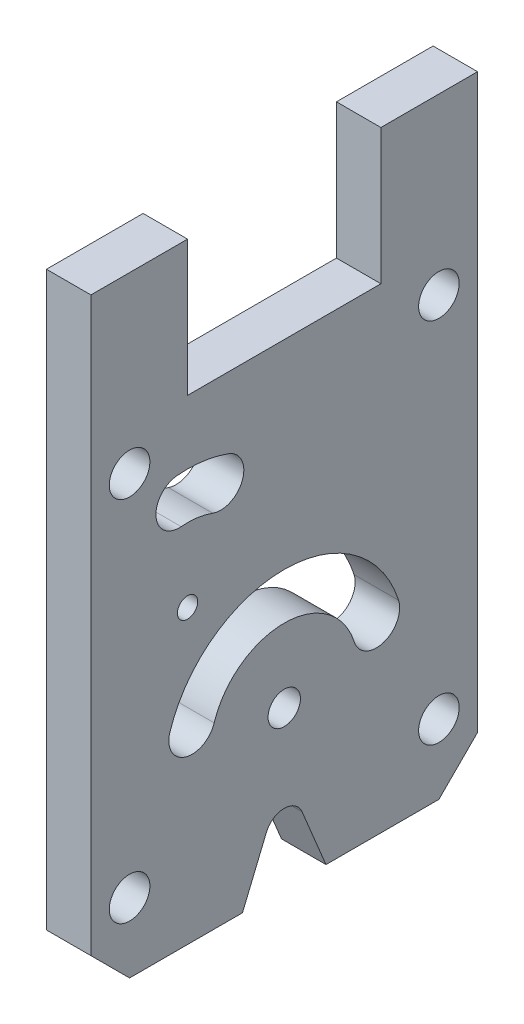
ISO-10303-21;
HEADER;
FILE_DESCRIPTION(('STEP AP214'),'2;1');
FILE_NAME('part.step','',(''),(''),'','','');
FILE_SCHEMA(('AUTOMOTIVE_DESIGN { 1 0 10303 214 1 1 1 1 }'));
ENDSEC;
DATA;
#1=APPLICATION_CONTEXT('core data for automotive mechanical design processes');
#2=APPLICATION_PROTOCOL_DEFINITION('international standard','automotive_design',2000,#1);
#3=PRODUCT_CONTEXT('',#1,'mechanical');
#4=PRODUCT('Part','Part','',(#3));
#5=PRODUCT_RELATED_PRODUCT_CATEGORY('part','',(#4));
#6=PRODUCT_DEFINITION_FORMATION('','',#4);
#7=PRODUCT_DEFINITION_CONTEXT('part definition',#1,'design');
#8=PRODUCT_DEFINITION('design','',#6,#7);
#9=PRODUCT_DEFINITION_SHAPE('','',#8);
#10=(LENGTH_UNIT() NAMED_UNIT(*) SI_UNIT(.MILLI.,.METRE.));
#11=(NAMED_UNIT(*) PLANE_ANGLE_UNIT() SI_UNIT($,.RADIAN.));
#12=(NAMED_UNIT(*) SI_UNIT($,.STERADIAN.) SOLID_ANGLE_UNIT());
#13=UNCERTAINTY_MEASURE_WITH_UNIT(LENGTH_MEASURE(1.E-05),#10,'distance_accuracy_value','');
#14=(GEOMETRIC_REPRESENTATION_CONTEXT(3) GLOBAL_UNCERTAINTY_ASSIGNED_CONTEXT((#13)) GLOBAL_UNIT_ASSIGNED_CONTEXT((#10,
#11,#12)) REPRESENTATION_CONTEXT('',''));
#15=CARTESIAN_POINT('',(0.,0.,0.));
#16=DIRECTION('',(0.,0.,1.));
#17=DIRECTION('',(1.,0.,0.));
#18=AXIS2_PLACEMENT_3D('',#15,#16,#17);
#19=CARTESIAN_POINT('',(-6.35,6.985,0.));
#20=DIRECTION('',(1.,0.,0.));
#21=DIRECTION('',(0.,0.,1.));
#22=AXIS2_PLACEMENT_3D('',#19,#20,#21);
#23=CYLINDRICAL_SURFACE('',#22,1.063625);
#24=CARTESIAN_POINT('',(-3.429,6.985,0.));
#25=DIRECTION('',(1.,0.,0.));
#26=DIRECTION('',(0.,1.,0.));
#27=AXIS2_PLACEMENT_3D('',#24,#25,#26);
#28=CIRCLE('',#27,1.063625);
#29=CARTESIAN_POINT('',(-3.429,8.048625,0.));
#30=VERTEX_POINT('',#29);
#31=EDGE_CURVE('E681',#30,#30,#28,.T.);
#32=ORIENTED_EDGE('',*,*,#31,.T.);
#33=EDGE_LOOP('',(#32));
#34=FACE_BOUND('',#33,.T.);
#35=CARTESIAN_POINT('',(-5.08,6.985,0.));
#36=DIRECTION('',(1.,0.,0.));
#37=DIRECTION('',(0.,0.,-1.));
#38=AXIS2_PLACEMENT_3D('',#35,#36,#37);
#39=CIRCLE('',#38,1.063625);
#40=CARTESIAN_POINT('',(-5.08,6.985,-1.063625));
#41=VERTEX_POINT('',#40);
#42=EDGE_CURVE('E617',#41,#41,#39,.T.);
#43=ORIENTED_EDGE('',*,*,#42,.F.);
#44=EDGE_LOOP('',(#43));
#45=FACE_BOUND('',#44,.T.);
#46=ADVANCED_FACE('F372',(#34,#45),#23,.F.);
#47=CARTESIAN_POINT('',(6.35,15.875,6.35));
#48=DIRECTION('',(-1.,0.,0.));
#49=DIRECTION('',(0.,0.,-1.));
#50=AXIS2_PLACEMENT_3D('',#47,#48,#49);
#51=CYLINDRICAL_SURFACE('',#50,0.66675);
#52=CARTESIAN_POINT('',(-3.429,15.875,6.35));
#53=DIRECTION('',(1.,0.,0.));
#54=DIRECTION('',(0.,1.,0.));
#55=AXIS2_PLACEMENT_3D('',#52,#53,#54);
#56=CIRCLE('',#55,0.66675);
#57=CARTESIAN_POINT('',(-3.429,16.54175,6.35));
#58=VERTEX_POINT('',#57);
#59=EDGE_CURVE('E598',#58,#58,#56,.T.);
#60=ORIENTED_EDGE('',*,*,#59,.T.);
#61=EDGE_LOOP('',(#60));
#62=FACE_BOUND('',#61,.T.);
#63=CARTESIAN_POINT('',(-5.08,15.875,6.35));
#64=DIRECTION('',(1.,0.,0.));
#65=DIRECTION('',(0.,0.,-1.));
#66=AXIS2_PLACEMENT_3D('',#63,#64,#65);
#67=CIRCLE('',#66,0.66675);
#68=CARTESIAN_POINT('',(-5.08,15.875,5.68325));
#69=VERTEX_POINT('',#68);
#70=EDGE_CURVE('E11',#69,#69,#67,.F.);
#71=ORIENTED_EDGE('',*,*,#70,.T.);
#72=EDGE_LOOP('',(#71));
#73=FACE_BOUND('',#72,.T.);
#74=ADVANCED_FACE('F785',(#62,#73),#51,.F.);
#75=CARTESIAN_POINT('',(-6.35,27.94,-12.7));
#76=DIRECTION('',(0.,0.,1.));
#77=DIRECTION('',(0.,-1.,0.));
#78=AXIS2_PLACEMENT_3D('',#75,#76,#77);
#79=PLANE('',#78);
#80=DIRECTION('',(0.,1.,0.));
#81=VECTOR('',#80,1.);
#82=CARTESIAN_POINT('',(-3.429,26.035,-12.7));
#83=LINE('',#82,#81);
#84=CARTESIAN_POINT('',(-3.429,-0.761999999999999,-12.7));
#85=VERTEX_POINT('',#84);
#86=CARTESIAN_POINT('',(-3.429,36.83,-12.7));
#87=VERTEX_POINT('',#86);
#88=EDGE_CURVE('E673',#85,#87,#83,.T.);
#89=ORIENTED_EDGE('',*,*,#88,.F.);
#90=DIRECTION('',(1.,0.,0.));
#91=VECTOR('',#90,1.);
#92=CARTESIAN_POINT('',(-6.35,-0.761999999999999,-12.7));
#93=LINE('',#92,#91);
#94=CARTESIAN_POINT('',(-6.35,-0.761999999999994,-12.7));
#95=VERTEX_POINT('',#94);
#96=EDGE_CURVE('E550',#95,#85,#93,.T.);
#97=ORIENTED_EDGE('',*,*,#96,.F.);
#98=DIRECTION('',(0.,1.,0.));
#99=VECTOR('',#98,1.);
#100=CARTESIAN_POINT('',(-6.35,27.94,-12.7));
#101=LINE('',#100,#99);
#102=CARTESIAN_POINT('',(-6.35,36.83,-12.7));
#103=VERTEX_POINT('',#102);
#104=EDGE_CURVE('E533',#95,#103,#101,.T.);
#105=ORIENTED_EDGE('',*,*,#104,.T.);
#106=DIRECTION('',(-1.,0.,0.));
#107=VECTOR('',#106,1.);
#108=CARTESIAN_POINT('',(7.49595308914414,36.83,-12.7));
#109=LINE('',#108,#107);
#110=EDGE_CURVE('E539',#87,#103,#109,.T.);
#111=ORIENTED_EDGE('',*,*,#110,.F.);
#112=EDGE_LOOP('',(#89,#97,#105,#111));
#113=FACE_BOUND('',#112,.T.);
#114=ADVANCED_FACE('F548',(#113),#79,.F.);
#115=CARTESIAN_POINT('',(-6.35,27.94,12.7));
#116=DIRECTION('',(0.,-1.,0.));
#117=DIRECTION('',(0.,0.,-1.));
#118=AXIS2_PLACEMENT_3D('',#115,#116,#117);
#119=PLANE('',#118);
#120=DIRECTION('',(0.,0.,1.));
#121=VECTOR('',#120,1.);
#122=CARTESIAN_POINT('',(-6.35,27.94,12.7));
#123=LINE('',#122,#121);
#124=CARTESIAN_POINT('',(-6.35,27.94,-6.35));
#125=VERTEX_POINT('',#124);
#126=CARTESIAN_POINT('',(-6.35,27.94,6.35));
#127=VERTEX_POINT('',#126);
#128=EDGE_CURVE('E376',#125,#127,#123,.T.);
#129=ORIENTED_EDGE('',*,*,#128,.T.);
#130=DIRECTION('',(-1.,0.,0.));
#131=VECTOR('',#130,1.);
#132=CARTESIAN_POINT('',(7.49595308914414,27.94,6.35));
#133=LINE('',#132,#131);
#134=CARTESIAN_POINT('',(-3.429,27.94,6.35));
#135=VERTEX_POINT('',#134);
#136=EDGE_CURVE('E732',#135,#127,#133,.T.);
#137=ORIENTED_EDGE('',*,*,#136,.F.);
#138=DIRECTION('',(0.,0.,-1.));
#139=VECTOR('',#138,1.);
#140=CARTESIAN_POINT('',(-3.429,27.94,12.7));
#141=LINE('',#140,#139);
#142=CARTESIAN_POINT('',(-3.429,27.94,-6.35));
#143=VERTEX_POINT('',#142);
#144=EDGE_CURVE('E612',#135,#143,#141,.T.);
#145=ORIENTED_EDGE('',*,*,#144,.T.);
#146=DIRECTION('',(-1.,0.,0.));
#147=VECTOR('',#146,1.);
#148=CARTESIAN_POINT('',(7.49595308914414,27.94,-6.35));
#149=LINE('',#148,#147);
#150=EDGE_CURVE('E749',#143,#125,#149,.T.);
#151=ORIENTED_EDGE('',*,*,#150,.T.);
#152=EDGE_LOOP('',(#129,#137,#145,#151));
#153=FACE_BOUND('',#152,.T.);
#154=ADVANCED_FACE('F804',(#153),#119,.F.);
#155=CARTESIAN_POINT('',(-6.35,-3.302,12.7));
#156=DIRECTION('',(0.,0.,-1.));
#157=DIRECTION('',(0.,1.,0.));
#158=AXIS2_PLACEMENT_3D('',#155,#156,#157);
#159=PLANE('',#158);
#160=DIRECTION('',(0.,-1.,0.));
#161=VECTOR('',#160,1.);
#162=CARTESIAN_POINT('',(-6.35,-3.302,12.7));
#163=LINE('',#162,#161);
#164=CARTESIAN_POINT('',(-6.35,36.83,12.7));
#165=VERTEX_POINT('',#164);
#166=CARTESIAN_POINT('',(-6.35,-0.76199999999999,12.7));
#167=VERTEX_POINT('',#166);
#168=EDGE_CURVE('E554',#165,#167,#163,.T.);
#169=ORIENTED_EDGE('',*,*,#168,.T.);
#170=DIRECTION('',(-1.,0.,0.));
#171=VECTOR('',#170,1.);
#172=CARTESIAN_POINT('',(-6.35,-0.76199999999999,12.7));
#173=LINE('',#172,#171);
#174=CARTESIAN_POINT('',(-3.429,-0.761999999999985,12.7));
#175=VERTEX_POINT('',#174);
#176=EDGE_CURVE('E584',#175,#167,#173,.T.);
#177=ORIENTED_EDGE('',*,*,#176,.F.);
#178=DIRECTION('',(0.,1.,0.));
#179=VECTOR('',#178,1.);
#180=CARTESIAN_POINT('',(-3.429,26.035,12.7));
#181=LINE('',#180,#179);
#182=CARTESIAN_POINT('',(-3.429,36.83,12.7));
#183=VERTEX_POINT('',#182);
#184=EDGE_CURVE('E670',#175,#183,#181,.T.);
#185=ORIENTED_EDGE('',*,*,#184,.T.);
#186=DIRECTION('',(-1.,0.,0.));
#187=VECTOR('',#186,1.);
#188=CARTESIAN_POINT('',(7.49595308914414,36.83,12.7));
#189=LINE('',#188,#187);
#190=EDGE_CURVE('E723',#183,#165,#189,.T.);
#191=ORIENTED_EDGE('',*,*,#190,.T.);
#192=EDGE_LOOP('',(#169,#177,#185,#191));
#193=FACE_BOUND('',#192,.T.);
#194=ADVANCED_FACE('F721',(#193),#159,.F.);
#195=CARTESIAN_POINT('',(-6.35,0.,0.));
#196=DIRECTION('',(1.,0.,0.));
#197=DIRECTION('',(0.,0.,1.));
#198=AXIS2_PLACEMENT_3D('',#195,#196,#197);
#199=PLANE('',#198);
#200=CARTESIAN_POINT('',(-6.35,1.27,-10.16));
#201=DIRECTION('',(1.,0.,0.));
#202=DIRECTION('',(0.,0.,-1.));
#203=AXIS2_PLACEMENT_3D('',#200,#201,#202);
#204=CIRCLE('',#203,1.3335);
#205=CARTESIAN_POINT('',(-6.35,1.27,-11.4935));
#206=VERTEX_POINT('',#205);
#207=EDGE_CURVE('E739',#206,#206,#204,.T.);
#208=ORIENTED_EDGE('',*,*,#207,.T.);
#209=EDGE_LOOP('',(#208));
#210=FACE_BOUND('',#209,.T.);
#211=CARTESIAN_POINT('',(-6.35,1.27,10.16));
#212=DIRECTION('',(1.,0.,0.));
#213=DIRECTION('',(0.,0.,-1.));
#214=AXIS2_PLACEMENT_3D('',#211,#212,#213);
#215=CIRCLE('',#214,1.3335);
#216=CARTESIAN_POINT('',(-6.35,1.27,8.82650000000001));
#217=VERTEX_POINT('',#216);
#218=EDGE_CURVE('E758',#217,#217,#215,.T.);
#219=ORIENTED_EDGE('',*,*,#218,.T.);
#220=EDGE_LOOP('',(#219));
#221=FACE_BOUND('',#220,.T.);
#222=CARTESIAN_POINT('',(-6.35,25.4,-10.16));
#223=DIRECTION('',(1.,0.,0.));
#224=DIRECTION('',(0.,0.,-1.));
#225=AXIS2_PLACEMENT_3D('',#222,#223,#224);
#226=CIRCLE('',#225,1.3335);
#227=CARTESIAN_POINT('',(-6.35,25.4,-11.4935));
#228=VERTEX_POINT('',#227);
#229=EDGE_CURVE('E767',#228,#228,#226,.T.);
#230=ORIENTED_EDGE('',*,*,#229,.T.);
#231=EDGE_LOOP('',(#230));
#232=FACE_BOUND('',#231,.T.);
#233=CARTESIAN_POINT('',(-6.35,25.4,10.16));
#234=DIRECTION('',(1.,0.,0.));
#235=DIRECTION('',(0.,0.,-1.));
#236=AXIS2_PLACEMENT_3D('',#233,#234,#235);
#237=CIRCLE('',#236,1.3335);
#238=CARTESIAN_POINT('',(-6.35,25.4,8.82650000000001));
#239=VERTEX_POINT('',#238);
#240=EDGE_CURVE('E773',#239,#239,#237,.T.);
#241=ORIENTED_EDGE('',*,*,#240,.T.);
#242=EDGE_LOOP('',(#241));
#243=FACE_BOUND('',#242,.T.);
#244=CARTESIAN_POINT('',(-6.35,15.875,6.35));
#245=DIRECTION('',(-1.,0.,0.));
#246=DIRECTION('',(0.,0.,1.));
#247=AXIS2_PLACEMENT_3D('',#244,#245,#246);
#248=CIRCLE('',#247,4.826);
#249=CARTESIAN_POINT('',(-6.35,20.6826356129908,6.77061361450017));
#250=VERTEX_POINT('',#249);
#251=CARTESIAN_POINT('',(-6.35,20.4099565879128,4.69941078831032));
#252=VERTEX_POINT('',#251);
#253=EDGE_CURVE('E635',#250,#252,#248,.T.);
#254=ORIENTED_EDGE('',*,*,#253,.T.);
#255=CARTESIAN_POINT('',(-6.35,21.8420481419905,4.178172089882));
#256=DIRECTION('',(1.,0.,0.));
#257=DIRECTION('',(0.,0.,-1.));
#258=AXIS2_PLACEMENT_3D('',#255,#256,#257);
#259=CIRCLE('',#258,1.524);
#260=CARTESIAN_POINT('',(-6.35,23.2741396960682,3.65693339145368));
#261=VERTEX_POINT('',#260);
#262=EDGE_CURVE('E632',#252,#261,#259,.T.);
#263=ORIENTED_EDGE('',*,*,#262,.T.);
#264=CARTESIAN_POINT('',(-6.35,15.875,6.35));
#265=DIRECTION('',(-1.,0.,0.));
#266=DIRECTION('',(0.,0.,1.));
#267=AXIS2_PLACEMENT_3D('',#264,#265,#266);
#268=CIRCLE('',#267,7.874);
#269=CARTESIAN_POINT('',(-6.35,23.7190370527744,7.03626431839501));
#270=VERTEX_POINT('',#269);
#271=EDGE_CURVE('E624',#270,#261,#268,.T.);
#272=ORIENTED_EDGE('',*,*,#271,.F.);
#273=CARTESIAN_POINT('',(-6.35,22.2008363328826,6.90343896644759));
#274=DIRECTION('',(1.,0.,0.));
#275=DIRECTION('',(0.,0.,-1.));
#276=AXIS2_PLACEMENT_3D('',#273,#274,#275);
#277=CIRCLE('',#276,1.524);
#278=EDGE_CURVE('E602',#270,#250,#277,.T.);
#279=ORIENTED_EDGE('',*,*,#278,.T.);
#280=EDGE_LOOP('',(#254,#263,#272,#279));
#281=FACE_BOUND('',#280,.T.);
#282=CARTESIAN_POINT('',(-6.35,6.985,0.));
#283=DIRECTION('',(-1.,0.,0.));
#284=DIRECTION('',(0.,0.,1.));
#285=AXIS2_PLACEMENT_3D('',#282,#283,#284);
#286=CIRCLE('',#285,4.826);
#287=CARTESIAN_POINT('',(-6.35,8.43620618840762,4.60263800431094));
#288=VERTEX_POINT('',#287);
#289=CARTESIAN_POINT('',(-6.35,8.43620618840763,-4.60263800431094));
#290=VERTEX_POINT('',#289);
#291=EDGE_CURVE('E652',#288,#290,#286,.T.);
#292=ORIENTED_EDGE('',*,*,#291,.T.);
#293=CARTESIAN_POINT('',(-6.35,8.89448182685214,-6.05610263725124));
#294=DIRECTION('',(1.,0.,0.));
#295=DIRECTION('',(0.,0.,-1.));
#296=AXIS2_PLACEMENT_3D('',#293,#294,#295);
#297=CIRCLE('',#296,1.524);
#298=CARTESIAN_POINT('',(-6.35,9.35275746529665,-7.50956727019154));
#299=VERTEX_POINT('',#298);
#300=EDGE_CURVE('E655',#290,#299,#297,.T.);
#301=ORIENTED_EDGE('',*,*,#300,.T.);
#302=CARTESIAN_POINT('',(-6.35,6.985,0.));
#303=DIRECTION('',(1.,0.,0.));
#304=DIRECTION('',(0.,0.,-1.));
#305=AXIS2_PLACEMENT_3D('',#302,#303,#304);
#306=CIRCLE('',#305,7.874);
#307=CARTESIAN_POINT('',(-6.35,9.35275746529665,7.50956727019154));
#308=VERTEX_POINT('',#307);
#309=EDGE_CURVE('E658',#299,#308,#306,.T.);
#310=ORIENTED_EDGE('',*,*,#309,.T.);
#311=CARTESIAN_POINT('',(-6.35,8.89448182685214,6.05610263725124));
#312=DIRECTION('',(1.,0.,0.));
#313=DIRECTION('',(0.,0.,-1.));
#314=AXIS2_PLACEMENT_3D('',#311,#312,#313);
#315=CIRCLE('',#314,1.524);
#316=EDGE_CURVE('E601',#308,#288,#315,.T.);
#317=ORIENTED_EDGE('',*,*,#316,.T.);
#318=EDGE_LOOP('',(#292,#301,#310,#317));
#319=FACE_BOUND('',#318,.T.);
#320=ORIENTED_EDGE('',*,*,#168,.F.);
#321=DIRECTION('',(0.,0.,1.));
#322=VECTOR('',#321,1.);
#323=CARTESIAN_POINT('',(-6.35,36.83,12.7));
#324=LINE('',#323,#322);
#325=CARTESIAN_POINT('',(-6.35,36.83,6.35));
#326=VERTEX_POINT('',#325);
#327=EDGE_CURVE('E718',#326,#165,#324,.T.);
#328=ORIENTED_EDGE('',*,*,#327,.F.);
#329=DIRECTION('',(0.,1.,0.));
#330=VECTOR('',#329,1.);
#331=CARTESIAN_POINT('',(-6.35,27.94,6.35));
#332=LINE('',#331,#330);
#333=EDGE_CURVE('E390',#127,#326,#332,.T.);
#334=ORIENTED_EDGE('',*,*,#333,.F.);
#335=ORIENTED_EDGE('',*,*,#128,.F.);
#336=DIRECTION('',(0.,-1.,0.));
#337=VECTOR('',#336,1.);
#338=CARTESIAN_POINT('',(-6.35,27.94,-6.35));
#339=LINE('',#338,#337);
#340=CARTESIAN_POINT('',(-6.35,36.83,-6.35));
#341=VERTEX_POINT('',#340);
#342=EDGE_CURVE('E535',#341,#125,#339,.T.);
#343=ORIENTED_EDGE('',*,*,#342,.F.);
#344=DIRECTION('',(0.,0.,1.));
#345=VECTOR('',#344,1.);
#346=CARTESIAN_POINT('',(-6.35,36.83,-12.7));
#347=LINE('',#346,#345);
#348=EDGE_CURVE('E527',#103,#341,#347,.T.);
#349=ORIENTED_EDGE('',*,*,#348,.F.);
#350=ORIENTED_EDGE('',*,*,#104,.F.);
#351=DIRECTION('',(0.,-0.707106781186546,0.707106781186549));
#352=VECTOR('',#351,1.);
#353=CARTESIAN_POINT('',(-6.35,-0.761999999999999,-12.7));
#354=LINE('',#353,#352);
#355=CARTESIAN_POINT('',(-6.35,-3.302,-10.16));
#356=VERTEX_POINT('',#355);
#357=EDGE_CURVE('E587',#356,#95,#354,.F.);
#358=ORIENTED_EDGE('',*,*,#357,.F.);
#359=DIRECTION('',(0.,0.,-1.));
#360=VECTOR('',#359,1.);
#361=CARTESIAN_POINT('',(-6.35,-3.302,-12.7));
#362=LINE('',#361,#360);
#363=CARTESIAN_POINT('',(-6.35,-3.302,-2.74237127732729));
#364=VERTEX_POINT('',#363);
#365=EDGE_CURVE('E551',#364,#356,#362,.T.);
#366=ORIENTED_EDGE('',*,*,#365,.F.);
#367=DIRECTION('',(0.,-0.923879532511288,-0.382683432365087));
#368=VECTOR('',#367,1.);
#369=CARTESIAN_POINT('',(-6.35,-3.302,-2.74237127732729));
#370=LINE('',#369,#368);
#371=CARTESIAN_POINT('',(-6.35,0.486007959103661,-1.17332700628933));
#372=VERTEX_POINT('',#371);
#373=EDGE_CURVE('E556',#372,#364,#370,.T.);
#374=ORIENTED_EDGE('',*,*,#373,.F.);
#375=CARTESIAN_POINT('',(-6.35,0.,0.));
#376=DIRECTION('',(-1.,0.,0.));
#377=DIRECTION('',(0.,0.,1.));
#378=AXIS2_PLACEMENT_3D('',#375,#376,#377);
#379=CIRCLE('',#378,1.27);
#380=CARTESIAN_POINT('',(-6.35,0.486007959103661,1.17332700628934));
#381=VERTEX_POINT('',#380);
#382=EDGE_CURVE('E692',#381,#372,#379,.T.);
#383=ORIENTED_EDGE('',*,*,#382,.F.);
#384=DIRECTION('',(0.,0.923879532511288,-0.382683432365087));
#385=VECTOR('',#384,1.);
#386=CARTESIAN_POINT('',(-6.35,0.486007959103661,1.17332700628934));
#387=LINE('',#386,#385);
#388=CARTESIAN_POINT('',(-6.35,-3.302,2.74237127732729));
#389=VERTEX_POINT('',#388);
#390=EDGE_CURVE('E566',#389,#381,#387,.T.);
#391=ORIENTED_EDGE('',*,*,#390,.F.);
#392=DIRECTION('',(0.,0.,-1.));
#393=VECTOR('',#392,1.);
#394=CARTESIAN_POINT('',(-6.35,-3.302,2.74237127732729));
#395=LINE('',#394,#393);
#396=CARTESIAN_POINT('',(-6.35,-3.302,10.16));
#397=VERTEX_POINT('',#396);
#398=EDGE_CURVE('E563',#397,#389,#395,.T.);
#399=ORIENTED_EDGE('',*,*,#398,.F.);
#400=DIRECTION('',(0.,0.707106781186549,0.707106781186546));
#401=VECTOR('',#400,1.);
#402=CARTESIAN_POINT('',(-6.35,-3.302,10.16));
#403=LINE('',#402,#401);
#404=EDGE_CURVE('E589',#167,#397,#403,.F.);
#405=ORIENTED_EDGE('',*,*,#404,.F.);
#406=EDGE_LOOP('',(#320,#328,#334,#335,#343,#349,#350,#358,#366,#374,#383,#391,#399,#405));
#407=FACE_BOUND('',#406,.T.);
#408=ADVANCED_FACE('F530',(#210,#221,#232,#243,#281,#319,#407),#199,.F.);
#409=CARTESIAN_POINT('',(-6.35,0.,0.));
#410=DIRECTION('',(1.,0.,0.));
#411=DIRECTION('',(0.,0.,1.));
#412=AXIS2_PLACEMENT_3D('',#409,#410,#411);
#413=CYLINDRICAL_SURFACE('',#412,1.27);
#414=DIRECTION('',(1.,0.,0.));
#415=VECTOR('',#414,1.);
#416=CARTESIAN_POINT('',(-6.35,0.486007959103661,1.17332700628934));
#417=LINE('',#416,#415);
#418=CARTESIAN_POINT('',(-3.429,0.486007959103661,1.17332700628934));
#419=VERTEX_POINT('',#418);
#420=EDGE_CURVE('E569',#381,#419,#417,.T.);
#421=ORIENTED_EDGE('',*,*,#420,.F.);
#422=ORIENTED_EDGE('',*,*,#382,.T.);
#423=DIRECTION('',(1.,0.,0.));
#424=VECTOR('',#423,1.);
#425=CARTESIAN_POINT('',(-6.35,0.486007959103661,-1.17332700628933));
#426=LINE('',#425,#424);
#427=CARTESIAN_POINT('',(-3.429,0.486007959103661,-1.17332700628934));
#428=VERTEX_POINT('',#427);
#429=EDGE_CURVE('E578',#372,#428,#426,.T.);
#430=ORIENTED_EDGE('',*,*,#429,.T.);
#431=CARTESIAN_POINT('',(-3.429,0.,0.));
#432=DIRECTION('',(1.,0.,0.));
#433=DIRECTION('',(0.,1.,0.));
#434=AXIS2_PLACEMENT_3D('',#431,#432,#433);
#435=CIRCLE('',#434,1.27);
#436=EDGE_CURVE('E686',#419,#428,#435,.F.);
#437=ORIENTED_EDGE('',*,*,#436,.F.);
#438=EDGE_LOOP('',(#421,#422,#430,#437));
#439=FACE_BOUND('',#438,.T.);
#440=ADVANCED_FACE('F374',(#439),#413,.F.);
#441=CARTESIAN_POINT('',(-6.35,-3.302,-2.74237127732729));
#442=DIRECTION('',(0.,0.382683432365087,-0.923879532511288));
#443=DIRECTION('',(0.,0.923879532511288,0.382683432365087));
#444=AXIS2_PLACEMENT_3D('',#441,#442,#443);
#445=PLANE('',#444);
#446=ORIENTED_EDGE('',*,*,#429,.F.);
#447=ORIENTED_EDGE('',*,*,#373,.T.);
#448=DIRECTION('',(1.,0.,0.));
#449=VECTOR('',#448,1.);
#450=CARTESIAN_POINT('',(-6.35,-3.302,-2.74237127732729));
#451=LINE('',#450,#449);
#452=CARTESIAN_POINT('',(-3.429,-3.302,-2.74237127732729));
#453=VERTEX_POINT('',#452);
#454=EDGE_CURVE('E575',#364,#453,#451,.T.);
#455=ORIENTED_EDGE('',*,*,#454,.T.);
#456=DIRECTION('',(0.,-0.923879532511288,-0.382683432365087));
#457=VECTOR('',#456,1.);
#458=CARTESIAN_POINT('',(-3.429,-3.302,-2.74237127732729));
#459=LINE('',#458,#457);
#460=EDGE_CURVE('E689',#428,#453,#459,.T.);
#461=ORIENTED_EDGE('',*,*,#460,.F.);
#462=EDGE_LOOP('',(#446,#447,#455,#461));
#463=FACE_BOUND('',#462,.T.);
#464=ADVANCED_FACE('F698',(#463),#445,.F.);
#465=CARTESIAN_POINT('',(-6.35,-3.302,-12.7));
#466=DIRECTION('',(0.,1.,0.));
#467=DIRECTION('',(0.,0.,1.));
#468=AXIS2_PLACEMENT_3D('',#465,#466,#467);
#469=PLANE('',#468);
#470=ORIENTED_EDGE('',*,*,#454,.F.);
#471=ORIENTED_EDGE('',*,*,#365,.T.);
#472=DIRECTION('',(-1.,0.,0.));
#473=VECTOR('',#472,1.);
#474=CARTESIAN_POINT('',(-6.35,-3.302,-10.16));
#475=LINE('',#474,#473);
#476=CARTESIAN_POINT('',(-3.429,-3.302,-10.16));
#477=VERTEX_POINT('',#476);
#478=EDGE_CURVE('E593',#477,#356,#475,.T.);
#479=ORIENTED_EDGE('',*,*,#478,.F.);
#480=DIRECTION('',(0.,0.,1.));
#481=VECTOR('',#480,1.);
#482=CARTESIAN_POINT('',(-3.429,-3.302,-12.7));
#483=LINE('',#482,#481);
#484=EDGE_CURVE('E678',#477,#453,#483,.T.);
#485=ORIENTED_EDGE('',*,*,#484,.T.);
#486=EDGE_LOOP('',(#470,#471,#479,#485));
#487=FACE_BOUND('',#486,.T.);
#488=ADVANCED_FACE('F702',(#487),#469,.F.);
#489=CARTESIAN_POINT('',(-6.35,-3.302,2.74237127732729));
#490=DIRECTION('',(0.,1.,0.));
#491=DIRECTION('',(0.,0.,1.));
#492=AXIS2_PLACEMENT_3D('',#489,#490,#491);
#493=PLANE('',#492);
#494=DIRECTION('',(1.,0.,0.));
#495=VECTOR('',#494,1.);
#496=CARTESIAN_POINT('',(-6.35,-3.302,10.16));
#497=LINE('',#496,#495);
#498=CARTESIAN_POINT('',(-3.429,-3.302,10.16));
#499=VERTEX_POINT('',#498);
#500=EDGE_CURVE('E581',#397,#499,#497,.T.);
#501=ORIENTED_EDGE('',*,*,#500,.F.);
#502=ORIENTED_EDGE('',*,*,#398,.T.);
#503=DIRECTION('',(1.,0.,0.));
#504=VECTOR('',#503,1.);
#505=CARTESIAN_POINT('',(-6.35,-3.302,2.74237127732729));
#506=LINE('',#505,#504);
#507=CARTESIAN_POINT('',(-3.429,-3.302,2.74237127732729));
#508=VERTEX_POINT('',#507);
#509=EDGE_CURVE('E572',#389,#508,#506,.T.);
#510=ORIENTED_EDGE('',*,*,#509,.T.);
#511=EDGE_CURVE('E675',#508,#499,#483,.T.);
#512=ORIENTED_EDGE('',*,*,#511,.T.);
#513=EDGE_LOOP('',(#501,#502,#510,#512));
#514=FACE_BOUND('',#513,.T.);
#515=ADVANCED_FACE('F714',(#514),#493,.F.);
#516=CARTESIAN_POINT('',(-6.35,0.486007959103661,1.17332700628934));
#517=DIRECTION('',(0.,0.382683432365087,0.923879532511288));
#518=DIRECTION('',(0.,-0.923879532511288,0.382683432365087));
#519=AXIS2_PLACEMENT_3D('',#516,#517,#518);
#520=PLANE('',#519);
#521=ORIENTED_EDGE('',*,*,#509,.F.);
#522=ORIENTED_EDGE('',*,*,#390,.T.);
#523=ORIENTED_EDGE('',*,*,#420,.T.);
#524=DIRECTION('',(0.,0.923879532511288,-0.382683432365087));
#525=VECTOR('',#524,1.);
#526=CARTESIAN_POINT('',(-3.429,0.486007959103662,1.17332700628934));
#527=LINE('',#526,#525);
#528=EDGE_CURVE('E684',#508,#419,#527,.T.);
#529=ORIENTED_EDGE('',*,*,#528,.F.);
#530=EDGE_LOOP('',(#521,#522,#523,#529));
#531=FACE_BOUND('',#530,.T.);
#532=ADVANCED_FACE('F712',(#531),#520,.F.);
#533=CARTESIAN_POINT('',(-6.35,-3.302,10.16));
#534=DIRECTION('',(0.,0.707106781186546,-0.707106781186549));
#535=DIRECTION('',(0.,0.707106781186549,0.707106781186546));
#536=AXIS2_PLACEMENT_3D('',#533,#534,#535);
#537=PLANE('',#536);
#538=DIRECTION('',(0.,-0.707106781186549,-0.707106781186546));
#539=VECTOR('',#538,1.);
#540=CARTESIAN_POINT('',(-3.429,-3.302,10.16));
#541=LINE('',#540,#539);
#542=EDGE_CURVE('E679',#499,#175,#541,.F.);
#543=ORIENTED_EDGE('',*,*,#542,.T.);
#544=ORIENTED_EDGE('',*,*,#176,.T.);
#545=ORIENTED_EDGE('',*,*,#404,.T.);
#546=ORIENTED_EDGE('',*,*,#500,.T.);
#547=EDGE_LOOP('',(#543,#544,#545,#546));
#548=FACE_BOUND('',#547,.T.);
#549=ADVANCED_FACE('F716',(#548),#537,.F.);
#550=CARTESIAN_POINT('',(-6.35,-0.761999999999999,-12.7));
#551=DIRECTION('',(0.,0.707106781186549,0.707106781186546));
#552=DIRECTION('',(0.,-0.707106781186546,0.707106781186549));
#553=AXIS2_PLACEMENT_3D('',#550,#551,#552);
#554=PLANE('',#553);
#555=DIRECTION('',(0.,0.707106781186546,-0.707106781186549));
#556=VECTOR('',#555,1.);
#557=CARTESIAN_POINT('',(-3.429,-0.761999999999999,-12.7));
#558=LINE('',#557,#556);
#559=EDGE_CURVE('E595',#85,#477,#558,.F.);
#560=ORIENTED_EDGE('',*,*,#559,.T.);
#561=ORIENTED_EDGE('',*,*,#478,.T.);
#562=ORIENTED_EDGE('',*,*,#357,.T.);
#563=ORIENTED_EDGE('',*,*,#96,.T.);
#564=EDGE_LOOP('',(#560,#561,#562,#563));
#565=FACE_BOUND('',#564,.T.);
#566=ADVANCED_FACE('F875',(#565),#554,.F.);
#567=CARTESIAN_POINT('',(-3.429,26.035,-12.7));
#568=DIRECTION('',(-1.,0.,0.));
#569=DIRECTION('',(0.,1.,0.));
#570=AXIS2_PLACEMENT_3D('',#567,#568,#569);
#571=PLANE('',#570);
#572=CARTESIAN_POINT('',(-3.429,1.27,-10.16));
#573=DIRECTION('',(1.,0.,0.));
#574=DIRECTION('',(0.,0.,-1.));
#575=AXIS2_PLACEMENT_3D('',#572,#573,#574);
#576=CIRCLE('',#575,1.3335);
#577=CARTESIAN_POINT('',(-3.429,1.27,-11.4935));
#578=VERTEX_POINT('',#577);
#579=EDGE_CURVE('E754',#578,#578,#576,.T.);
#580=ORIENTED_EDGE('',*,*,#579,.F.);
#581=EDGE_LOOP('',(#580));
#582=FACE_BOUND('',#581,.T.);
#583=CARTESIAN_POINT('',(-3.429,1.27,10.16));
#584=DIRECTION('',(1.,0.,0.));
#585=DIRECTION('',(0.,0.,-1.));
#586=AXIS2_PLACEMENT_3D('',#583,#584,#585);
#587=CIRCLE('',#586,1.3335);
#588=CARTESIAN_POINT('',(-3.429,1.27,8.82650000000001));
#589=VERTEX_POINT('',#588);
#590=EDGE_CURVE('E762',#589,#589,#587,.T.);
#591=ORIENTED_EDGE('',*,*,#590,.F.);
#592=EDGE_LOOP('',(#591));
#593=FACE_BOUND('',#592,.T.);
#594=CARTESIAN_POINT('',(-3.429,25.4,-10.16));
#595=DIRECTION('',(1.,0.,0.));
#596=DIRECTION('',(0.,0.,-1.));
#597=AXIS2_PLACEMENT_3D('',#594,#595,#596);
#598=CIRCLE('',#597,1.3335);
#599=CARTESIAN_POINT('',(-3.429,25.4,-11.4935));
#600=VERTEX_POINT('',#599);
#601=EDGE_CURVE('E770',#600,#600,#598,.T.);
#602=ORIENTED_EDGE('',*,*,#601,.F.);
#603=EDGE_LOOP('',(#602));
#604=FACE_BOUND('',#603,.T.);
#605=CARTESIAN_POINT('',(-3.429,25.4,10.16));
#606=DIRECTION('',(1.,0.,0.));
#607=DIRECTION('',(0.,0.,-1.));
#608=AXIS2_PLACEMENT_3D('',#605,#606,#607);
#609=CIRCLE('',#608,1.3335);
#610=CARTESIAN_POINT('',(-3.429,25.4,8.82650000000001));
#611=VERTEX_POINT('',#610);
#612=EDGE_CURVE('E775',#611,#611,#609,.T.);
#613=ORIENTED_EDGE('',*,*,#612,.F.);
#614=EDGE_LOOP('',(#613));
#615=FACE_BOUND('',#614,.T.);
#616=CARTESIAN_POINT('',(-3.429,15.875,6.35));
#617=DIRECTION('',(1.,0.,0.));
#618=DIRECTION('',(0.,1.,0.));
#619=AXIS2_PLACEMENT_3D('',#616,#617,#618);
#620=CIRCLE('',#619,7.874);
#621=CARTESIAN_POINT('',(-3.429,23.7190370527744,7.03626431839501));
#622=VERTEX_POINT('',#621);
#623=CARTESIAN_POINT('',(-3.429,23.2741396960682,3.65693339145368));
#624=VERTEX_POINT('',#623);
#625=EDGE_CURVE('E608',#622,#624,#620,.F.);
#626=ORIENTED_EDGE('',*,*,#625,.T.);
#627=CARTESIAN_POINT('',(-3.429,21.8420481419905,4.178172089882));
#628=DIRECTION('',(1.,0.,0.));
#629=DIRECTION('',(0.,1.,0.));
#630=AXIS2_PLACEMENT_3D('',#627,#628,#629);
#631=CIRCLE('',#630,1.524);
#632=CARTESIAN_POINT('',(-3.429,20.4099565879128,4.69941078831032));
#633=VERTEX_POINT('',#632);
#634=EDGE_CURVE('E605',#633,#624,#631,.T.);
#635=ORIENTED_EDGE('',*,*,#634,.F.);
#636=CARTESIAN_POINT('',(-3.429,15.875,6.35));
#637=DIRECTION('',(1.,0.,0.));
#638=DIRECTION('',(0.,1.,0.));
#639=AXIS2_PLACEMENT_3D('',#636,#637,#638);
#640=CIRCLE('',#639,4.826);
#641=CARTESIAN_POINT('',(-3.429,20.6826356129908,6.77061361450017));
#642=VERTEX_POINT('',#641);
#643=EDGE_CURVE('E597',#642,#633,#640,.F.);
#644=ORIENTED_EDGE('',*,*,#643,.F.);
#645=CARTESIAN_POINT('',(-3.429,22.2008363328826,6.90343896644759));
#646=DIRECTION('',(1.,0.,0.));
#647=DIRECTION('',(0.,1.,0.));
#648=AXIS2_PLACEMENT_3D('',#645,#646,#647);
#649=CIRCLE('',#648,1.524);
#650=EDGE_CURVE('E382',#622,#642,#649,.T.);
#651=ORIENTED_EDGE('',*,*,#650,.F.);
#652=EDGE_LOOP('',(#626,#635,#644,#651));
#653=FACE_BOUND('',#652,.T.);
#654=ORIENTED_EDGE('',*,*,#59,.F.);
#655=EDGE_LOOP('',(#654));
#656=FACE_BOUND('',#655,.T.);
#657=CARTESIAN_POINT('',(-3.429,6.985,0.));
#658=DIRECTION('',(1.,0.,0.));
#659=DIRECTION('',(0.,1.,0.));
#660=AXIS2_PLACEMENT_3D('',#657,#658,#659);
#661=CIRCLE('',#660,7.874);
#662=CARTESIAN_POINT('',(-3.429,9.35275746529665,7.50956727019154));
#663=VERTEX_POINT('',#662);
#664=CARTESIAN_POINT('',(-3.429,9.35275746529665,-7.50956727019154));
#665=VERTEX_POINT('',#664);
#666=EDGE_CURVE('E642',#663,#665,#661,.F.);
#667=ORIENTED_EDGE('',*,*,#666,.T.);
#668=CARTESIAN_POINT('',(-3.429,8.89448182685214,-6.05610263725124));
#669=DIRECTION('',(1.,0.,0.));
#670=DIRECTION('',(0.,1.,0.));
#671=AXIS2_PLACEMENT_3D('',#668,#669,#670);
#672=CIRCLE('',#671,1.524);
#673=CARTESIAN_POINT('',(-3.429,8.43620618840763,-4.60263800431094));
#674=VERTEX_POINT('',#673);
#675=EDGE_CURVE('E639',#665,#674,#672,.F.);
#676=ORIENTED_EDGE('',*,*,#675,.T.);
#677=CARTESIAN_POINT('',(-3.429,6.985,0.));
#678=DIRECTION('',(1.,0.,0.));
#679=DIRECTION('',(0.,1.,0.));
#680=AXIS2_PLACEMENT_3D('',#677,#678,#679);
#681=CIRCLE('',#680,4.826);
#682=CARTESIAN_POINT('',(-3.429,8.43620618840762,4.60263800431094));
#683=VERTEX_POINT('',#682);
#684=EDGE_CURVE('E649',#674,#683,#681,.T.);
#685=ORIENTED_EDGE('',*,*,#684,.T.);
#686=CARTESIAN_POINT('',(-3.429,8.89448182685214,6.05610263725124));
#687=DIRECTION('',(1.,0.,0.));
#688=DIRECTION('',(0.,1.,0.));
#689=AXIS2_PLACEMENT_3D('',#686,#687,#688);
#690=CIRCLE('',#689,1.524);
#691=EDGE_CURVE('E646',#683,#663,#690,.F.);
#692=ORIENTED_EDGE('',*,*,#691,.T.);
#693=EDGE_LOOP('',(#667,#676,#685,#692));
#694=FACE_BOUND('',#693,.T.);
#695=ORIENTED_EDGE('',*,*,#31,.F.);
#696=EDGE_LOOP('',(#695));
#697=FACE_BOUND('',#696,.T.);
#698=ORIENTED_EDGE('',*,*,#436,.T.);
#699=ORIENTED_EDGE('',*,*,#460,.T.);
#700=ORIENTED_EDGE('',*,*,#484,.F.);
#701=ORIENTED_EDGE('',*,*,#559,.F.);
#702=ORIENTED_EDGE('',*,*,#88,.T.);
#703=DIRECTION('',(0.,0.,-1.));
#704=VECTOR('',#703,1.);
#705=CARTESIAN_POINT('',(-3.429,36.83,-12.7));
#706=LINE('',#705,#704);
#707=CARTESIAN_POINT('',(-3.429,36.83,-6.35));
#708=VERTEX_POINT('',#707);
#709=EDGE_CURVE('E542',#708,#87,#706,.T.);
#710=ORIENTED_EDGE('',*,*,#709,.F.);
#711=DIRECTION('',(0.,1.,0.));
#712=VECTOR('',#711,1.);
#713=CARTESIAN_POINT('',(-3.429,27.94,-6.35));
#714=LINE('',#713,#712);
#715=EDGE_CURVE('E746',#143,#708,#714,.T.);
#716=ORIENTED_EDGE('',*,*,#715,.F.);
#717=ORIENTED_EDGE('',*,*,#144,.F.);
#718=DIRECTION('',(0.,-1.,0.));
#719=VECTOR('',#718,1.);
#720=CARTESIAN_POINT('',(-3.429,27.94,6.35));
#721=LINE('',#720,#719);
#722=CARTESIAN_POINT('',(-3.429,36.83,6.35));
#723=VERTEX_POINT('',#722);
#724=EDGE_CURVE('E727',#723,#135,#721,.T.);
#725=ORIENTED_EDGE('',*,*,#724,.F.);
#726=DIRECTION('',(0.,0.,-1.));
#727=VECTOR('',#726,1.);
#728=CARTESIAN_POINT('',(-3.429,36.83,12.7));
#729=LINE('',#728,#727);
#730=EDGE_CURVE('E730',#183,#723,#729,.T.);
#731=ORIENTED_EDGE('',*,*,#730,.F.);
#732=ORIENTED_EDGE('',*,*,#184,.F.);
#733=ORIENTED_EDGE('',*,*,#542,.F.);
#734=ORIENTED_EDGE('',*,*,#511,.F.);
#735=ORIENTED_EDGE('',*,*,#528,.T.);
#736=EDGE_LOOP('',(#698,#699,#700,#701,#702,#710,#716,#717,#725,#731,#732,#733,#734,#735));
#737=FACE_BOUND('',#736,.T.);
#738=ADVANCED_FACE('F705',(#582,#593,#604,#615,#653,#656,#694,#697,#737),#571,.F.);
#739=CARTESIAN_POINT('',(13.4798653786887,8.89448182685214,6.05610263725124));
#740=DIRECTION('',(-1.,0.,0.));
#741=DIRECTION('',(0.,0.,-1.));
#742=AXIS2_PLACEMENT_3D('',#739,#740,#741);
#743=CYLINDRICAL_SURFACE('',#742,1.524);
#744=ORIENTED_EDGE('',*,*,#691,.F.);
#745=DIRECTION('',(-1.,0.,0.));
#746=VECTOR('',#745,1.);
#747=CARTESIAN_POINT('',(13.4798653786887,8.43620618840762,4.60263800431094));
#748=LINE('',#747,#746);
#749=EDGE_CURVE('E661',#683,#288,#748,.T.);
#750=ORIENTED_EDGE('',*,*,#749,.T.);
#751=ORIENTED_EDGE('',*,*,#316,.F.);
#752=DIRECTION('',(-1.,0.,0.));
#753=VECTOR('',#752,1.);
#754=CARTESIAN_POINT('',(13.4798653786887,9.35275746529665,7.50956727019154));
#755=LINE('',#754,#753);
#756=EDGE_CURVE('E643',#663,#308,#755,.T.);
#757=ORIENTED_EDGE('',*,*,#756,.F.);
#758=EDGE_LOOP('',(#744,#750,#751,#757));
#759=FACE_BOUND('',#758,.T.);
#760=ADVANCED_FACE('F887',(#759),#743,.F.);
#761=CARTESIAN_POINT('',(13.4798653786887,6.985,0.));
#762=DIRECTION('',(-1.,0.,0.));
#763=DIRECTION('',(0.,0.,-1.));
#764=AXIS2_PLACEMENT_3D('',#761,#762,#763);
#765=CYLINDRICAL_SURFACE('',#764,7.874);
#766=ORIENTED_EDGE('',*,*,#666,.F.);
#767=ORIENTED_EDGE('',*,*,#756,.T.);
#768=ORIENTED_EDGE('',*,*,#309,.F.);
#769=DIRECTION('',(-1.,0.,0.));
#770=VECTOR('',#769,1.);
#771=CARTESIAN_POINT('',(13.4798653786887,9.35275746529665,-7.50956727019154));
#772=LINE('',#771,#770);
#773=EDGE_CURVE('E663',#665,#299,#772,.T.);
#774=ORIENTED_EDGE('',*,*,#773,.F.);
#775=EDGE_LOOP('',(#766,#767,#768,#774));
#776=FACE_BOUND('',#775,.T.);
#777=ADVANCED_FACE('F901',(#776),#765,.F.);
#778=CARTESIAN_POINT('',(13.4798653786887,8.89448182685214,-6.05610263725124));
#779=DIRECTION('',(-1.,0.,0.));
#780=DIRECTION('',(0.,0.,-1.));
#781=AXIS2_PLACEMENT_3D('',#778,#779,#780);
#782=CYLINDRICAL_SURFACE('',#781,1.524);
#783=ORIENTED_EDGE('',*,*,#675,.F.);
#784=ORIENTED_EDGE('',*,*,#773,.T.);
#785=ORIENTED_EDGE('',*,*,#300,.F.);
#786=DIRECTION('',(-1.,0.,0.));
#787=VECTOR('',#786,1.);
#788=CARTESIAN_POINT('',(13.4798653786887,8.43620618840763,-4.60263800431094));
#789=LINE('',#788,#787);
#790=EDGE_CURVE('E665',#674,#290,#789,.T.);
#791=ORIENTED_EDGE('',*,*,#790,.F.);
#792=EDGE_LOOP('',(#783,#784,#785,#791));
#793=FACE_BOUND('',#792,.T.);
#794=ADVANCED_FACE('F909',(#793),#782,.F.);
#795=CARTESIAN_POINT('',(13.4798653786887,6.985,0.));
#796=DIRECTION('',(-1.,0.,0.));
#797=DIRECTION('',(0.,0.,-1.));
#798=AXIS2_PLACEMENT_3D('',#795,#796,#797);
#799=CYLINDRICAL_SURFACE('',#798,4.826);
#800=ORIENTED_EDGE('',*,*,#684,.F.);
#801=ORIENTED_EDGE('',*,*,#790,.T.);
#802=ORIENTED_EDGE('',*,*,#291,.F.);
#803=ORIENTED_EDGE('',*,*,#749,.F.);
#804=EDGE_LOOP('',(#800,#801,#802,#803));
#805=FACE_BOUND('',#804,.T.);
#806=ADVANCED_FACE('F917',(#805),#799,.T.);
#807=CARTESIAN_POINT('',(6.35,15.875,6.35));
#808=DIRECTION('',(-1.,0.,0.));
#809=DIRECTION('',(0.,0.,-1.));
#810=AXIS2_PLACEMENT_3D('',#807,#808,#809);
#811=CYLINDRICAL_SURFACE('',#810,4.826);
#812=DIRECTION('',(-1.,0.,0.));
#813=VECTOR('',#812,1.);
#814=CARTESIAN_POINT('',(6.35,20.6826356129908,6.77061361450017));
#815=LINE('',#814,#813);
#816=EDGE_CURVE('E398',#642,#250,#815,.T.);
#817=ORIENTED_EDGE('',*,*,#816,.F.);
#818=ORIENTED_EDGE('',*,*,#643,.T.);
#819=DIRECTION('',(-1.,0.,0.));
#820=VECTOR('',#819,1.);
#821=CARTESIAN_POINT('',(6.35,20.4099565879128,4.69941078831032));
#822=LINE('',#821,#820);
#823=EDGE_CURVE('E625',#633,#252,#822,.T.);
#824=ORIENTED_EDGE('',*,*,#823,.T.);
#825=ORIENTED_EDGE('',*,*,#253,.F.);
#826=EDGE_LOOP('',(#817,#818,#824,#825));
#827=FACE_BOUND('',#826,.T.);
#828=ADVANCED_FACE('F925',(#827),#811,.T.);
#829=CARTESIAN_POINT('',(6.35,21.8420481419905,4.178172089882));
#830=DIRECTION('',(-1.,0.,0.));
#831=DIRECTION('',(0.,0.,-1.));
#832=AXIS2_PLACEMENT_3D('',#829,#830,#831);
#833=CYLINDRICAL_SURFACE('',#832,1.524);
#834=ORIENTED_EDGE('',*,*,#823,.F.);
#835=ORIENTED_EDGE('',*,*,#634,.T.);
#836=DIRECTION('',(-1.,0.,0.));
#837=VECTOR('',#836,1.);
#838=CARTESIAN_POINT('',(6.35,23.2741396960682,3.65693339145368));
#839=LINE('',#838,#837);
#840=EDGE_CURVE('E627',#624,#261,#839,.T.);
#841=ORIENTED_EDGE('',*,*,#840,.T.);
#842=ORIENTED_EDGE('',*,*,#262,.F.);
#843=EDGE_LOOP('',(#834,#835,#841,#842));
#844=FACE_BOUND('',#843,.T.);
#845=ADVANCED_FACE('F933',(#844),#833,.F.);
#846=CARTESIAN_POINT('',(6.35,15.875,6.35));
#847=DIRECTION('',(-1.,0.,0.));
#848=DIRECTION('',(0.,0.,-1.));
#849=AXIS2_PLACEMENT_3D('',#846,#847,#848);
#850=CYLINDRICAL_SURFACE('',#849,7.874);
#851=ORIENTED_EDGE('',*,*,#625,.F.);
#852=DIRECTION('',(-1.,0.,0.));
#853=VECTOR('',#852,1.);
#854=CARTESIAN_POINT('',(6.35,23.7190370527744,7.03626431839501));
#855=LINE('',#854,#853);
#856=EDGE_CURVE('E616',#622,#270,#855,.T.);
#857=ORIENTED_EDGE('',*,*,#856,.T.);
#858=ORIENTED_EDGE('',*,*,#271,.T.);
#859=ORIENTED_EDGE('',*,*,#840,.F.);
#860=EDGE_LOOP('',(#851,#857,#858,#859));
#861=FACE_BOUND('',#860,.T.);
#862=ADVANCED_FACE('F941',(#861),#850,.F.);
#863=CARTESIAN_POINT('',(6.35,22.2008363328826,6.90343896644759));
#864=DIRECTION('',(-1.,0.,0.));
#865=DIRECTION('',(0.,0.,-1.));
#866=AXIS2_PLACEMENT_3D('',#863,#864,#865);
#867=CYLINDRICAL_SURFACE('',#866,1.524);
#868=ORIENTED_EDGE('',*,*,#856,.F.);
#869=ORIENTED_EDGE('',*,*,#650,.T.);
#870=ORIENTED_EDGE('',*,*,#816,.T.);
#871=ORIENTED_EDGE('',*,*,#278,.F.);
#872=EDGE_LOOP('',(#868,#869,#870,#871));
#873=FACE_BOUND('',#872,.T.);
#874=ADVANCED_FACE('F949',(#873),#867,.F.);
#875=CARTESIAN_POINT('',(-5.08,15.875,6.35));
#876=DIRECTION('',(-1.,0.,0.));
#877=DIRECTION('',(0.,0.,-1.));
#878=AXIS2_PLACEMENT_3D('',#875,#876,#877);
#879=PLANE('',#878);
#880=ORIENTED_EDGE('',*,*,#70,.F.);
#881=EDGE_LOOP('',(#880));
#882=FACE_BOUND('',#881,.T.);
#883=ADVANCED_FACE('F957',(#882),#879,.F.);
#884=CARTESIAN_POINT('',(-5.08,6.985,0.));
#885=DIRECTION('',(-1.,0.,0.));
#886=DIRECTION('',(0.,0.,-1.));
#887=AXIS2_PLACEMENT_3D('',#884,#885,#886);
#888=PLANE('',#887);
#889=ORIENTED_EDGE('',*,*,#42,.T.);
#890=EDGE_LOOP('',(#889));
#891=FACE_BOUND('',#890,.T.);
#892=ADVANCED_FACE('F782',(#891),#888,.F.);
#893=CARTESIAN_POINT('',(-3.429,25.4,10.16));
#894=DIRECTION('',(-1.,0.,0.));
#895=DIRECTION('',(0.,0.,-1.));
#896=AXIS2_PLACEMENT_3D('',#893,#894,#895);
#897=CYLINDRICAL_SURFACE('',#896,1.3335);
#898=ORIENTED_EDGE('',*,*,#612,.T.);
#899=EDGE_LOOP('',(#898));
#900=FACE_BOUND('',#899,.T.);
#901=ORIENTED_EDGE('',*,*,#240,.F.);
#902=EDGE_LOOP('',(#901));
#903=FACE_BOUND('',#902,.T.);
#904=ADVANCED_FACE('F971',(#900,#903),#897,.F.);
#905=CARTESIAN_POINT('',(-3.429,25.4,-10.16));
#906=DIRECTION('',(-1.,0.,0.));
#907=DIRECTION('',(0.,0.,-1.));
#908=AXIS2_PLACEMENT_3D('',#905,#906,#907);
#909=CYLINDRICAL_SURFACE('',#908,1.3335);
#910=ORIENTED_EDGE('',*,*,#601,.T.);
#911=EDGE_LOOP('',(#910));
#912=FACE_BOUND('',#911,.T.);
#913=ORIENTED_EDGE('',*,*,#229,.F.);
#914=EDGE_LOOP('',(#913));
#915=FACE_BOUND('',#914,.T.);
#916=ADVANCED_FACE('F978',(#912,#915),#909,.F.);
#917=CARTESIAN_POINT('',(-3.429,1.27,10.16));
#918=DIRECTION('',(-1.,0.,0.));
#919=DIRECTION('',(0.,0.,-1.));
#920=AXIS2_PLACEMENT_3D('',#917,#918,#919);
#921=CYLINDRICAL_SURFACE('',#920,1.3335);
#922=ORIENTED_EDGE('',*,*,#590,.T.);
#923=EDGE_LOOP('',(#922));
#924=FACE_BOUND('',#923,.T.);
#925=ORIENTED_EDGE('',*,*,#218,.F.);
#926=EDGE_LOOP('',(#925));
#927=FACE_BOUND('',#926,.T.);
#928=ADVANCED_FACE('F985',(#924,#927),#921,.F.);
#929=CARTESIAN_POINT('',(-3.429,1.27,-10.16));
#930=DIRECTION('',(-1.,0.,0.));
#931=DIRECTION('',(0.,0.,-1.));
#932=AXIS2_PLACEMENT_3D('',#929,#930,#931);
#933=CYLINDRICAL_SURFACE('',#932,1.3335);
#934=ORIENTED_EDGE('',*,*,#579,.T.);
#935=EDGE_LOOP('',(#934));
#936=FACE_BOUND('',#935,.T.);
#937=ORIENTED_EDGE('',*,*,#207,.F.);
#938=EDGE_LOOP('',(#937));
#939=FACE_BOUND('',#938,.T.);
#940=ADVANCED_FACE('F993',(#936,#939),#933,.F.);
#941=CARTESIAN_POINT('',(7.49595308914414,36.83,12.7));
#942=DIRECTION('',(0.,1.,0.));
#943=DIRECTION('',(0.,0.,1.));
#944=AXIS2_PLACEMENT_3D('',#941,#942,#943);
#945=PLANE('',#944);
#946=ORIENTED_EDGE('',*,*,#730,.T.);
#947=DIRECTION('',(-1.,0.,0.));
#948=VECTOR('',#947,1.);
#949=CARTESIAN_POINT('',(7.49595308914414,36.83,6.35));
#950=LINE('',#949,#948);
#951=EDGE_CURVE('E728',#723,#326,#950,.T.);
#952=ORIENTED_EDGE('',*,*,#951,.T.);
#953=ORIENTED_EDGE('',*,*,#327,.T.);
#954=ORIENTED_EDGE('',*,*,#190,.F.);
#955=EDGE_LOOP('',(#946,#952,#953,#954));
#956=FACE_BOUND('',#955,.T.);
#957=ADVANCED_FACE('F1001',(#956),#945,.T.);
#958=CARTESIAN_POINT('',(7.49595308914414,27.94,6.35));
#959=DIRECTION('',(0.,0.,-1.));
#960=DIRECTION('',(1.,0.,0.));
#961=AXIS2_PLACEMENT_3D('',#958,#959,#960);
#962=PLANE('',#961);
#963=ORIENTED_EDGE('',*,*,#724,.T.);
#964=ORIENTED_EDGE('',*,*,#136,.T.);
#965=ORIENTED_EDGE('',*,*,#333,.T.);
#966=ORIENTED_EDGE('',*,*,#951,.F.);
#967=EDGE_LOOP('',(#963,#964,#965,#966));
#968=FACE_BOUND('',#967,.T.);
#969=ADVANCED_FACE('F1008',(#968),#962,.T.);
#970=CARTESIAN_POINT('',(7.49595308914414,27.94,-6.35));
#971=DIRECTION('',(0.,0.,1.));
#972=DIRECTION('',(-1.,0.,0.));
#973=AXIS2_PLACEMENT_3D('',#970,#971,#972);
#974=PLANE('',#973);
#975=ORIENTED_EDGE('',*,*,#715,.T.);
#976=DIRECTION('',(-1.,0.,0.));
#977=VECTOR('',#976,1.);
#978=CARTESIAN_POINT('',(7.49595308914414,36.83,-6.35));
#979=LINE('',#978,#977);
#980=EDGE_CURVE('E546',#708,#341,#979,.T.);
#981=ORIENTED_EDGE('',*,*,#980,.T.);
#982=ORIENTED_EDGE('',*,*,#342,.T.);
#983=ORIENTED_EDGE('',*,*,#150,.F.);
#984=EDGE_LOOP('',(#975,#981,#982,#983));
#985=FACE_BOUND('',#984,.T.);
#986=ADVANCED_FACE('F1015',(#985),#974,.T.);
#987=CARTESIAN_POINT('',(7.49595308914414,36.83,-12.7));
#988=DIRECTION('',(0.,1.,0.));
#989=DIRECTION('',(0.,0.,1.));
#990=AXIS2_PLACEMENT_3D('',#987,#988,#989);
#991=PLANE('',#990);
#992=ORIENTED_EDGE('',*,*,#709,.T.);
#993=ORIENTED_EDGE('',*,*,#110,.T.);
#994=ORIENTED_EDGE('',*,*,#348,.T.);
#995=ORIENTED_EDGE('',*,*,#980,.F.);
#996=EDGE_LOOP('',(#992,#993,#994,#995));
#997=FACE_BOUND('',#996,.T.);
#998=ADVANCED_FACE('F540',(#997),#991,.T.);
#999=CLOSED_SHELL('',(#46,#74,#114,#154,#194,#408,#440,#464,#488,#515,#532,#549,#566,#738,#760,
#777,#794,#806,#828,#845,#862,#874,#883,#892,#904,#916,#928,#940,#957,#969,#986,#998));
#1000=MANIFOLD_SOLID_BREP('B2',#999);
#1001=ADVANCED_BREP_SHAPE_REPRESENTATION('',(#18,#1000),#14);
#1002=SHAPE_DEFINITION_REPRESENTATION(#9,#1001);
ENDSEC;
END-ISO-10303-21;
